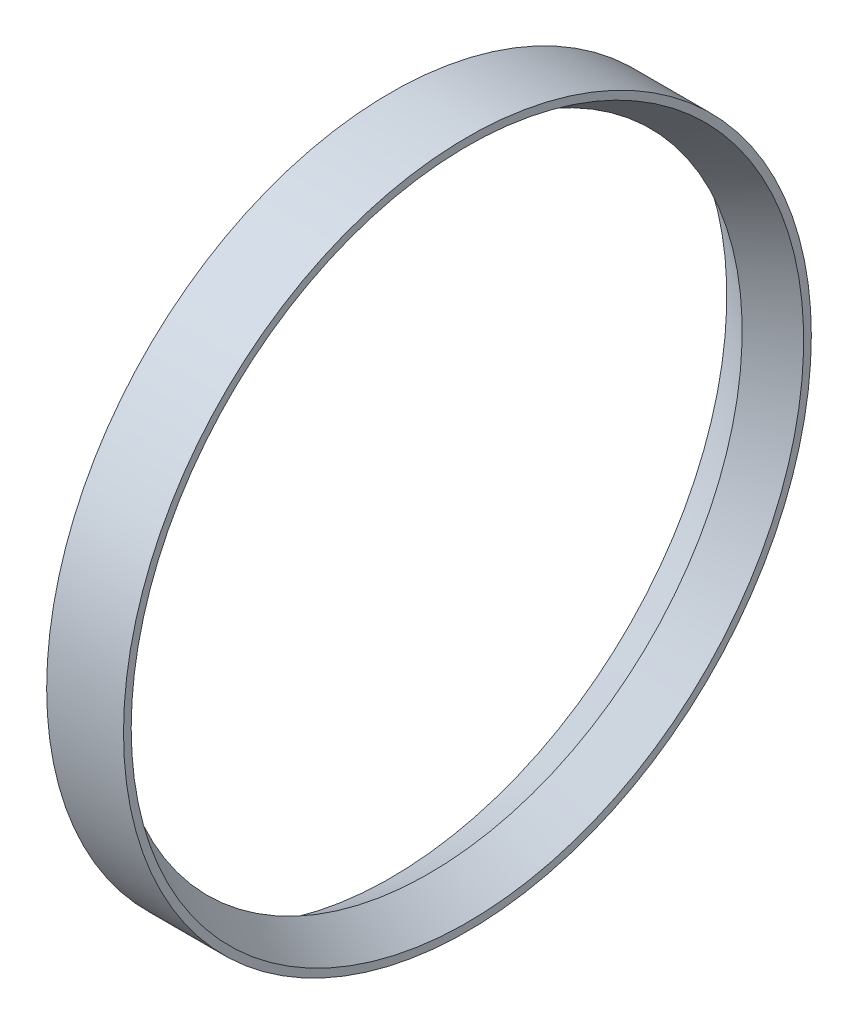
ISO-10303-21;
HEADER;
FILE_DESCRIPTION(('STEP AP214'),'2;1');
FILE_NAME('part.step','',(''),(''),'','','');
FILE_SCHEMA(('AUTOMOTIVE_DESIGN { 1 0 10303 214 1 1 1 1 }'));
ENDSEC;
DATA;
#1=APPLICATION_CONTEXT('core data for automotive mechanical design processes');
#2=APPLICATION_PROTOCOL_DEFINITION('international standard','automotive_design',2000,#1);
#3=PRODUCT_CONTEXT('',#1,'mechanical');
#4=PRODUCT('Part','Part','',(#3));
#5=PRODUCT_RELATED_PRODUCT_CATEGORY('part','',(#4));
#6=PRODUCT_DEFINITION_FORMATION('','',#4);
#7=PRODUCT_DEFINITION_CONTEXT('part definition',#1,'design');
#8=PRODUCT_DEFINITION('design','',#6,#7);
#9=PRODUCT_DEFINITION_SHAPE('','',#8);
#10=(LENGTH_UNIT() NAMED_UNIT(*) SI_UNIT(.MILLI.,.METRE.));
#11=(NAMED_UNIT(*) PLANE_ANGLE_UNIT() SI_UNIT($,.RADIAN.));
#12=(NAMED_UNIT(*) SI_UNIT($,.STERADIAN.) SOLID_ANGLE_UNIT());
#13=UNCERTAINTY_MEASURE_WITH_UNIT(LENGTH_MEASURE(1.E-05),#10,'distance_accuracy_value','');
#14=(GEOMETRIC_REPRESENTATION_CONTEXT(3) GLOBAL_UNCERTAINTY_ASSIGNED_CONTEXT((#13)) GLOBAL_UNIT_ASSIGNED_CONTEXT((#10,
#11,#12)) REPRESENTATION_CONTEXT('',''));
#15=CARTESIAN_POINT('',(0.,0.,0.));
#16=DIRECTION('',(0.,0.,1.));
#17=DIRECTION('',(1.,0.,0.));
#18=AXIS2_PLACEMENT_3D('',#15,#16,#17);
#19=CARTESIAN_POINT('',(4.,0.,35.8));
#20=DIRECTION('',(1.,0.,0.));
#21=DIRECTION('',(0.,0.,-1.));
#22=AXIS2_PLACEMENT_3D('',#19,#20,#21);
#23=PLANE('',#22);
#24=CARTESIAN_POINT('',(4.,0.,0.));
#25=DIRECTION('',(-1.,0.,0.));
#26=DIRECTION('',(0.,0.,1.));
#27=AXIS2_PLACEMENT_3D('',#24,#25,#26);
#28=CIRCLE('',#27,35.);
#29=CARTESIAN_POINT('',(4.,0.,35.));
#30=VERTEX_POINT('',#29);
#31=EDGE_CURVE('E52',#30,#30,#28,.T.);
#32=ORIENTED_EDGE('',*,*,#31,.T.);
#33=EDGE_LOOP('',(#32));
#34=FACE_BOUND('',#33,.T.);
#35=CARTESIAN_POINT('',(4.,0.,0.));
#36=DIRECTION('',(-1.,0.,0.));
#37=DIRECTION('',(0.,0.,1.));
#38=AXIS2_PLACEMENT_3D('',#35,#36,#37);
#39=CIRCLE('',#38,35.8);
#40=CARTESIAN_POINT('',(4.,0.,35.8));
#41=VERTEX_POINT('',#40);
#42=EDGE_CURVE('E10',#41,#41,#39,.T.);
#43=ORIENTED_EDGE('',*,*,#42,.F.);
#44=EDGE_LOOP('',(#43));
#45=FACE_BOUND('',#44,.T.);
#46=ADVANCED_FACE('F33',(#34,#45),#23,.T.);
#47=CARTESIAN_POINT('',(0.,0.,0.));
#48=DIRECTION('',(-1.,0.,0.));
#49=DIRECTION('',(0.,0.,1.));
#50=AXIS2_PLACEMENT_3D('',#47,#48,#49);
#51=CYLINDRICAL_SURFACE('',#50,35.8);
#52=ORIENTED_EDGE('',*,*,#42,.T.);
#53=EDGE_LOOP('',(#52));
#54=FACE_BOUND('',#53,.T.);
#55=CARTESIAN_POINT('',(-4.,0.,0.));
#56=DIRECTION('',(-1.,0.,0.));
#57=DIRECTION('',(0.,0.,1.));
#58=AXIS2_PLACEMENT_3D('',#55,#56,#57);
#59=CIRCLE('',#58,35.8);
#60=CARTESIAN_POINT('',(-4.,0.,35.8));
#61=VERTEX_POINT('',#60);
#62=EDGE_CURVE('E39',#61,#61,#59,.T.);
#63=ORIENTED_EDGE('',*,*,#62,.F.);
#64=EDGE_LOOP('',(#63));
#65=FACE_BOUND('',#64,.T.);
#66=ADVANCED_FACE('F70',(#54,#65),#51,.T.);
#67=CARTESIAN_POINT('',(-4.,0.,35.));
#68=DIRECTION('',(-1.,0.,0.));
#69=DIRECTION('',(0.,0.,1.));
#70=AXIS2_PLACEMENT_3D('',#67,#68,#69);
#71=PLANE('',#70);
#72=ORIENTED_EDGE('',*,*,#62,.T.);
#73=EDGE_LOOP('',(#72));
#74=FACE_BOUND('',#73,.T.);
#75=CARTESIAN_POINT('',(-4.,0.,0.));
#76=DIRECTION('',(-1.,0.,0.));
#77=DIRECTION('',(0.,0.,1.));
#78=AXIS2_PLACEMENT_3D('',#75,#76,#77);
#79=CIRCLE('',#78,35.);
#80=CARTESIAN_POINT('',(-4.,0.,35.));
#81=VERTEX_POINT('',#80);
#82=EDGE_CURVE('E43',#81,#81,#79,.T.);
#83=ORIENTED_EDGE('',*,*,#82,.F.);
#84=EDGE_LOOP('',(#83));
#85=FACE_BOUND('',#84,.T.);
#86=ADVANCED_FACE('F66',(#74,#85),#71,.T.);
#87=CARTESIAN_POINT('',(0.,0.,0.));
#88=DIRECTION('',(-1.,0.,0.));
#89=DIRECTION('',(0.,0.,1.));
#90=AXIS2_PLACEMENT_3D('',#87,#88,#89);
#91=CONICAL_SURFACE('',#90,32.6,0.540419500270584);
#92=ORIENTED_EDGE('',*,*,#82,.T.);
#93=EDGE_LOOP('',(#92));
#94=FACE_BOUND('',#93,.T.);
#95=CARTESIAN_POINT('',(0.,0.,0.));
#96=DIRECTION('',(-1.,0.,0.));
#97=DIRECTION('',(0.,0.,1.));
#98=AXIS2_PLACEMENT_3D('',#95,#96,#97);
#99=CIRCLE('',#98,32.6);
#100=CARTESIAN_POINT('',(0.,0.,32.6));
#101=VERTEX_POINT('',#100);
#102=EDGE_CURVE('E47',#101,#101,#99,.T.);
#103=ORIENTED_EDGE('',*,*,#102,.F.);
#104=EDGE_LOOP('',(#103));
#105=FACE_BOUND('',#104,.T.);
#106=ADVANCED_FACE('F60',(#94,#105),#91,.F.);
#107=CARTESIAN_POINT('',(4.,0.,0.));
#108=DIRECTION('',(1.,0.,0.));
#109=DIRECTION('',(0.,0.,-1.));
#110=AXIS2_PLACEMENT_3D('',#107,#108,#109);
#111=CONICAL_SURFACE('',#110,35.,0.540419500270584);
#112=ORIENTED_EDGE('',*,*,#102,.T.);
#113=EDGE_LOOP('',(#112));
#114=FACE_BOUND('',#113,.T.);
#115=ORIENTED_EDGE('',*,*,#31,.F.);
#116=EDGE_LOOP('',(#115));
#117=FACE_BOUND('',#116,.T.);
#118=ADVANCED_FACE('F58',(#114,#117),#111,.F.);
#119=CLOSED_SHELL('',(#46,#66,#86,#106,#118));
#120=MANIFOLD_SOLID_BREP('B2',#119);
#121=ADVANCED_BREP_SHAPE_REPRESENTATION('',(#18,#120),#14);
#122=SHAPE_DEFINITION_REPRESENTATION(#9,#121);
ENDSEC;
END-ISO-10303-21;
